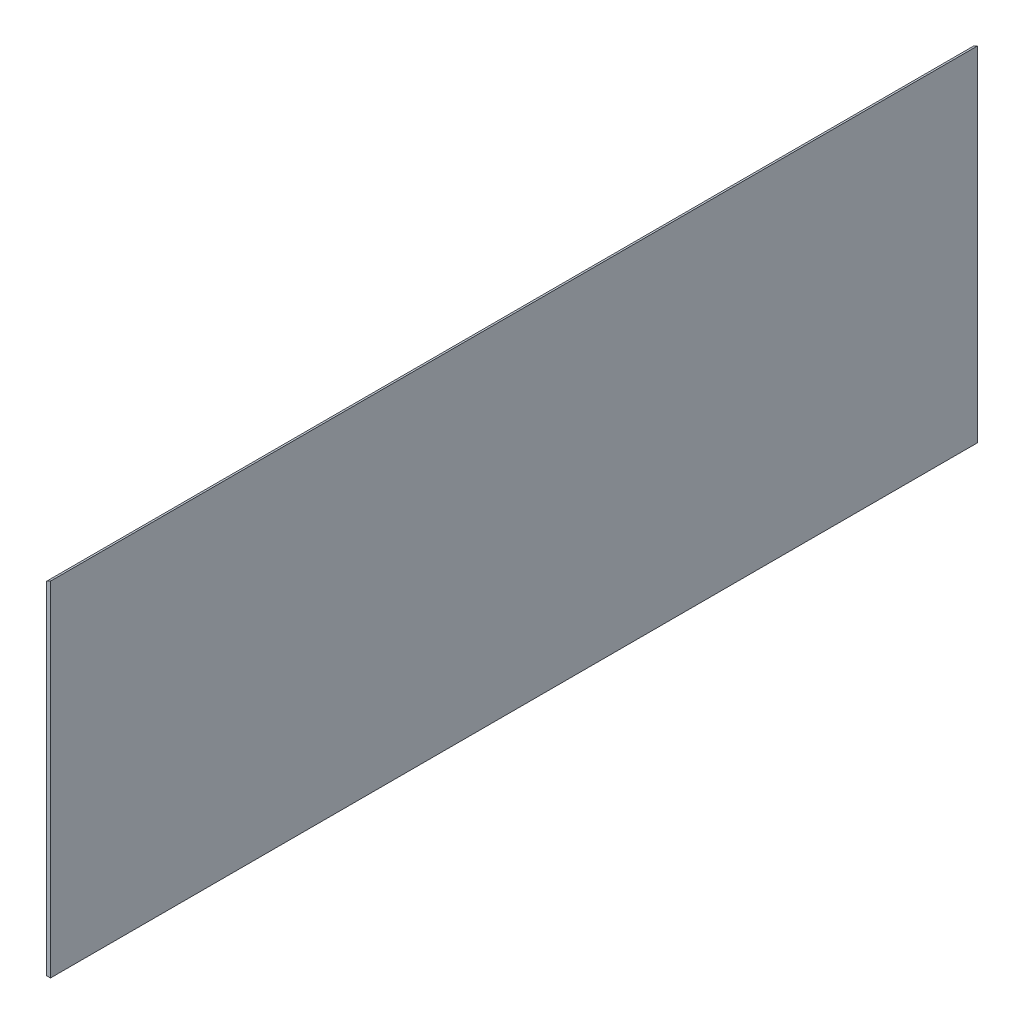
ISO-10303-21;
HEADER;
FILE_DESCRIPTION(('STEP AP214'),'2;1');
FILE_NAME('part.step','',(''),(''),'','','');
FILE_SCHEMA(('AUTOMOTIVE_DESIGN { 1 0 10303 214 1 1 1 1 }'));
ENDSEC;
DATA;
#1=APPLICATION_CONTEXT('core data for automotive mechanical design processes');
#2=APPLICATION_PROTOCOL_DEFINITION('international standard','automotive_design',2000,#1);
#3=PRODUCT_CONTEXT('',#1,'mechanical');
#4=PRODUCT('Part','Part','',(#3));
#5=PRODUCT_RELATED_PRODUCT_CATEGORY('part','',(#4));
#6=PRODUCT_DEFINITION_FORMATION('','',#4);
#7=PRODUCT_DEFINITION_CONTEXT('part definition',#1,'design');
#8=PRODUCT_DEFINITION('design','',#6,#7);
#9=PRODUCT_DEFINITION_SHAPE('','',#8);
#10=(LENGTH_UNIT() NAMED_UNIT(*) SI_UNIT(.MILLI.,.METRE.));
#11=(NAMED_UNIT(*) PLANE_ANGLE_UNIT() SI_UNIT($,.RADIAN.));
#12=(NAMED_UNIT(*) SI_UNIT($,.STERADIAN.) SOLID_ANGLE_UNIT());
#13=UNCERTAINTY_MEASURE_WITH_UNIT(LENGTH_MEASURE(1.E-05),#10,'distance_accuracy_value','');
#14=(GEOMETRIC_REPRESENTATION_CONTEXT(3) GLOBAL_UNCERTAINTY_ASSIGNED_CONTEXT((#13)) GLOBAL_UNIT_ASSIGNED_CONTEXT((#10,
#11,#12)) REPRESENTATION_CONTEXT('',''));
#15=CARTESIAN_POINT('',(0.,0.,0.));
#16=DIRECTION('',(0.,0.,1.));
#17=DIRECTION('',(1.,0.,0.));
#18=AXIS2_PLACEMENT_3D('',#15,#16,#17);
#19=CARTESIAN_POINT('',(12192.,10868.8293766007,-12192.));
#20=DIRECTION('',(0.,0.,1.));
#21=DIRECTION('',(1.,0.,0.));
#22=AXIS2_PLACEMENT_3D('',#19,#20,#21);
#23=PLANE('',#22);
#24=DIRECTION('',(0.888496348848055,0.458883686879013,0.));
#25=VECTOR('',#24,1.);
#26=CARTESIAN_POINT('',(12192.,10868.8293766007,-12192.));
#27=LINE('',#26,#25);
#28=CARTESIAN_POINT('',(-50.8000000000003,4545.76321093083,-12192.));
#29=VERTEX_POINT('',#28);
#30=CARTESIAN_POINT('',(4.7679880361686E-12,4572.,-12192.));
#31=VERTEX_POINT('',#30);
#32=EDGE_CURVE('E38',#29,#31,#27,.T.);
#33=ORIENTED_EDGE('',*,*,#32,.T.);
#34=DIRECTION('',(0.,-1.,0.));
#35=VECTOR('',#34,1.);
#36=CARTESIAN_POINT('',(0.,0.,-12192.));
#37=LINE('',#36,#35);
#38=CARTESIAN_POINT('',(0.,50.8,-12192.));
#39=VERTEX_POINT('',#38);
#40=EDGE_CURVE('E77',#31,#39,#37,.T.);
#41=ORIENTED_EDGE('',*,*,#40,.T.);
#42=DIRECTION('',(1.,0.,0.));
#43=VECTOR('',#42,1.);
#44=CARTESIAN_POINT('',(0.,50.8,-12192.));
#45=LINE('',#44,#43);
#46=CARTESIAN_POINT('',(-50.8,50.8,-12192.));
#47=VERTEX_POINT('',#46);
#48=EDGE_CURVE('E86',#47,#39,#45,.T.);
#49=ORIENTED_EDGE('',*,*,#48,.F.);
#50=DIRECTION('',(0.,-1.,0.));
#51=VECTOR('',#50,1.);
#52=CARTESIAN_POINT('',(-50.8,0.,-12192.));
#53=LINE('',#52,#51);
#54=EDGE_CURVE('E89',#29,#47,#53,.T.);
#55=ORIENTED_EDGE('',*,*,#54,.F.);
#56=EDGE_LOOP('',(#33,#41,#49,#55));
#57=FACE_BOUND('',#56,.T.);
#58=ADVANCED_FACE('F34',(#57),#23,.F.);
#59=CARTESIAN_POINT('',(4.7679880361686E-12,4572.,-12192.));
#60=DIRECTION('',(0.458883686879013,-0.888496348848055,0.));
#61=DIRECTION('',(0.888496348848055,0.458883686879013,0.));
#62=AXIS2_PLACEMENT_3D('',#59,#60,#61);
#63=PLANE('',#62);
#64=DIRECTION('',(0.,0.,-1.));
#65=VECTOR('',#64,1.);
#66=CARTESIAN_POINT('',(0.,4572.,-12192.));
#67=LINE('',#66,#65);
#68=CARTESIAN_POINT('',(0.,4572.,0.));
#69=VERTEX_POINT('',#68);
#70=EDGE_CURVE('E81',#69,#31,#67,.T.);
#71=ORIENTED_EDGE('',*,*,#70,.T.);
#72=ORIENTED_EDGE('',*,*,#32,.F.);
#73=DIRECTION('',(0.,0.,-1.));
#74=VECTOR('',#73,1.);
#75=CARTESIAN_POINT('',(-50.8,4545.76321093083,0.));
#76=LINE('',#75,#74);
#77=CARTESIAN_POINT('',(-50.8,4545.76321093083,0.));
#78=VERTEX_POINT('',#77);
#79=EDGE_CURVE('E102',#78,#29,#76,.T.);
#80=ORIENTED_EDGE('',*,*,#79,.F.);
#81=DIRECTION('',(-0.888496348848055,-0.458883686879013,0.));
#82=VECTOR('',#81,1.);
#83=CARTESIAN_POINT('',(-1843.36775090388,3619.95175477608,0.));
#84=LINE('',#83,#82);
#85=EDGE_CURVE('E51',#69,#78,#84,.T.);
#86=ORIENTED_EDGE('',*,*,#85,.F.);
#87=EDGE_LOOP('',(#71,#72,#80,#86));
#88=FACE_BOUND('',#87,.T.);
#89=ADVANCED_FACE('F91',(#88),#63,.F.);
#90=CARTESIAN_POINT('',(0.,50.8,0.));
#91=DIRECTION('',(0.,1.,0.));
#92=DIRECTION('',(0.,0.,1.));
#93=AXIS2_PLACEMENT_3D('',#90,#91,#92);
#94=PLANE('',#93);
#95=DIRECTION('',(0.,0.,1.));
#96=VECTOR('',#95,1.);
#97=CARTESIAN_POINT('',(-50.8,50.8,0.));
#98=LINE('',#97,#96);
#99=CARTESIAN_POINT('',(-50.8,50.8,0.));
#100=VERTEX_POINT('',#99);
#101=EDGE_CURVE('E95',#47,#100,#98,.T.);
#102=ORIENTED_EDGE('',*,*,#101,.F.);
#103=ORIENTED_EDGE('',*,*,#48,.T.);
#104=DIRECTION('',(0.,0.,1.));
#105=VECTOR('',#104,1.);
#106=CARTESIAN_POINT('',(0.,50.8,0.));
#107=LINE('',#106,#105);
#108=CARTESIAN_POINT('',(0.,50.8,0.));
#109=VERTEX_POINT('',#108);
#110=EDGE_CURVE('E82',#39,#109,#107,.T.);
#111=ORIENTED_EDGE('',*,*,#110,.T.);
#112=DIRECTION('',(1.,0.,0.));
#113=VECTOR('',#112,1.);
#114=CARTESIAN_POINT('',(0.,50.8,0.));
#115=LINE('',#114,#113);
#116=EDGE_CURVE('E58',#100,#109,#115,.T.);
#117=ORIENTED_EDGE('',*,*,#116,.F.);
#118=EDGE_LOOP('',(#102,#103,#111,#117));
#119=FACE_BOUND('',#118,.T.);
#120=ADVANCED_FACE('F108',(#119),#94,.F.);
#121=CARTESIAN_POINT('',(0.,0.,0.));
#122=DIRECTION('',(1.,0.,0.));
#123=DIRECTION('',(0.,0.,-1.));
#124=AXIS2_PLACEMENT_3D('',#121,#122,#123);
#125=PLANE('',#124);
#126=ORIENTED_EDGE('',*,*,#110,.F.);
#127=ORIENTED_EDGE('',*,*,#40,.F.);
#128=ORIENTED_EDGE('',*,*,#70,.F.);
#129=DIRECTION('',(0.,1.,0.));
#130=VECTOR('',#129,1.);
#131=CARTESIAN_POINT('',(0.,0.,0.));
#132=LINE('',#131,#130);
#133=EDGE_CURVE('E11',#109,#69,#132,.T.);
#134=ORIENTED_EDGE('',*,*,#133,.F.);
#135=EDGE_LOOP('',(#126,#127,#128,#134));
#136=FACE_BOUND('',#135,.T.);
#137=ADVANCED_FACE('F79',(#136),#125,.T.);
#138=CARTESIAN_POINT('',(0.,50.8,0.));
#139=DIRECTION('',(0.,0.,-1.));
#140=DIRECTION('',(-1.,0.,0.));
#141=AXIS2_PLACEMENT_3D('',#138,#139,#140);
#142=PLANE('',#141);
#143=DIRECTION('',(0.,1.,0.));
#144=VECTOR('',#143,1.);
#145=CARTESIAN_POINT('',(-50.8,0.,0.));
#146=LINE('',#145,#144);
#147=EDGE_CURVE('E43',#100,#78,#146,.T.);
#148=ORIENTED_EDGE('',*,*,#147,.F.);
#149=ORIENTED_EDGE('',*,*,#116,.T.);
#150=ORIENTED_EDGE('',*,*,#133,.T.);
#151=ORIENTED_EDGE('',*,*,#85,.T.);
#152=EDGE_LOOP('',(#148,#149,#150,#151));
#153=FACE_BOUND('',#152,.T.);
#154=ADVANCED_FACE('F36',(#153),#142,.F.);
#155=CARTESIAN_POINT('',(-50.8,0.,0.));
#156=DIRECTION('',(1.,0.,0.));
#157=DIRECTION('',(0.,0.,-1.));
#158=AXIS2_PLACEMENT_3D('',#155,#156,#157);
#159=PLANE('',#158);
#160=ORIENTED_EDGE('',*,*,#147,.T.);
#161=ORIENTED_EDGE('',*,*,#79,.T.);
#162=ORIENTED_EDGE('',*,*,#54,.T.);
#163=ORIENTED_EDGE('',*,*,#101,.T.);
#164=EDGE_LOOP('',(#160,#161,#162,#163));
#165=FACE_BOUND('',#164,.T.);
#166=ADVANCED_FACE('F105',(#165),#159,.F.);
#167=CLOSED_SHELL('',(#58,#89,#120,#137,#154,#166));
#168=MANIFOLD_SOLID_BREP('B2',#167);
#169=ADVANCED_BREP_SHAPE_REPRESENTATION('',(#18,#168),#14);
#170=SHAPE_DEFINITION_REPRESENTATION(#9,#169);
ENDSEC;
END-ISO-10303-21;
